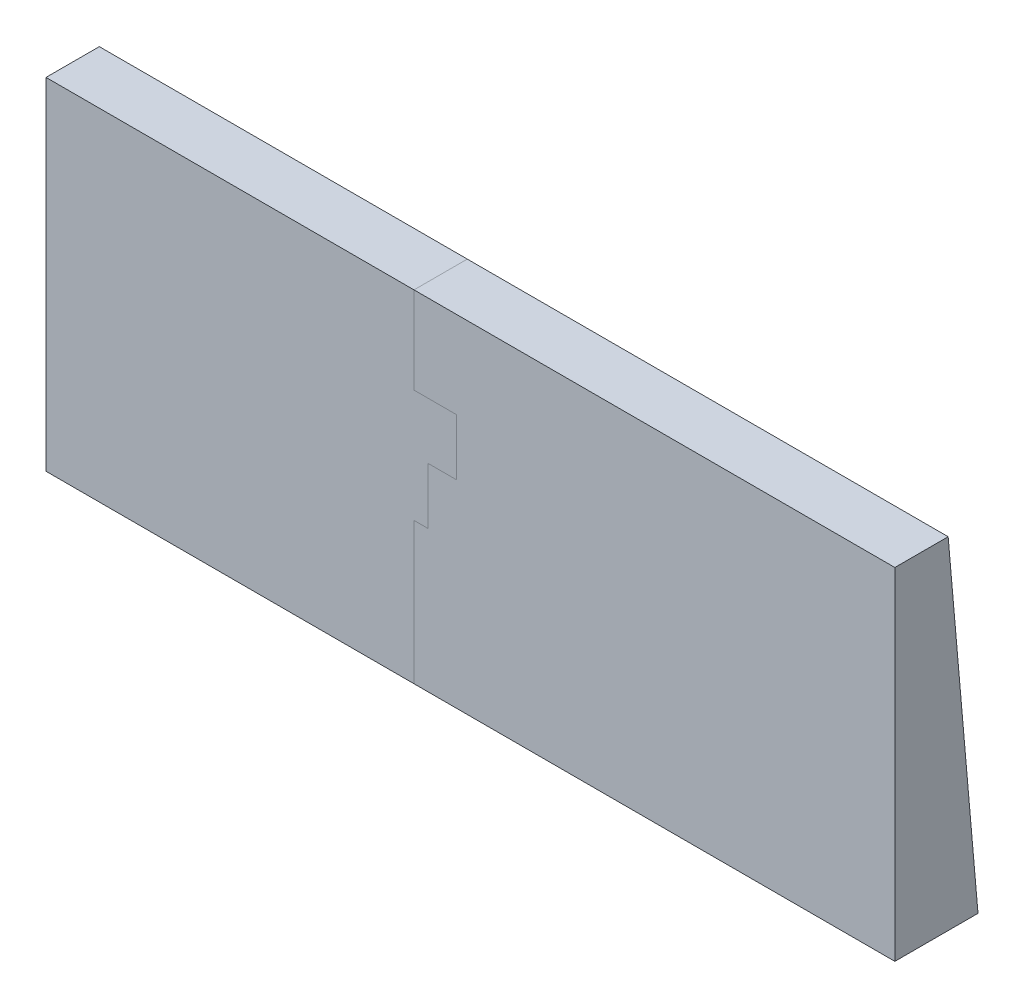
ISO-10303-21;
HEADER;
FILE_DESCRIPTION(('STEP AP214'),'2;1');
FILE_NAME('part.step','',(''),(''),'','','');
FILE_SCHEMA(('AUTOMOTIVE_DESIGN { 1 0 10303 214 1 1 1 1 }'));
ENDSEC;
DATA;
#1=APPLICATION_CONTEXT('core data for automotive mechanical design processes');
#2=APPLICATION_PROTOCOL_DEFINITION('international standard','automotive_design',2000,#1);
#3=PRODUCT_CONTEXT('',#1,'mechanical');
#4=PRODUCT('Part','Part','',(#3));
#5=PRODUCT_RELATED_PRODUCT_CATEGORY('part','',(#4));
#6=PRODUCT_DEFINITION_FORMATION('','',#4);
#7=PRODUCT_DEFINITION_CONTEXT('part definition',#1,'design');
#8=PRODUCT_DEFINITION('design','',#6,#7);
#9=PRODUCT_DEFINITION_SHAPE('','',#8);
#10=(LENGTH_UNIT() NAMED_UNIT(*) SI_UNIT(.MILLI.,.METRE.));
#11=(NAMED_UNIT(*) PLANE_ANGLE_UNIT() SI_UNIT($,.RADIAN.));
#12=(NAMED_UNIT(*) SI_UNIT($,.STERADIAN.) SOLID_ANGLE_UNIT());
#13=UNCERTAINTY_MEASURE_WITH_UNIT(LENGTH_MEASURE(1.E-05),#10,'distance_accuracy_value','');
#14=(GEOMETRIC_REPRESENTATION_CONTEXT(3) GLOBAL_UNCERTAINTY_ASSIGNED_CONTEXT((#13)) GLOBAL_UNIT_ASSIGNED_CONTEXT((#10,
#11,#12)) REPRESENTATION_CONTEXT('',''));
#15=CARTESIAN_POINT('',(0.,0.,0.));
#16=DIRECTION('',(0.,0.,1.));
#17=DIRECTION('',(1.,0.,0.));
#18=AXIS2_PLACEMENT_3D('',#15,#16,#17);
#19=CARTESIAN_POINT('',(-152.504909845493,105.48227561378,-10.0882189509876));
#20=DIRECTION('',(1.,0.,0.));
#21=DIRECTION('',(0.,1.,0.));
#22=AXIS2_PLACEMENT_3D('',#19,#20,#21);
#23=PLANE('',#22);
#24=DIRECTION('',(0.,-0.996194698091747,-0.087155742747645));
#25=VECTOR('',#24,1.);
#26=CARTESIAN_POINT('',(-152.504909845494,0.801256391980354,-9.15840246824548));
#27=LINE('',#26,#25);
#28=CARTESIAN_POINT('',(-152.504909845493,105.482275613781,0.));
#29=VERTEX_POINT('',#28);
#30=CARTESIAN_POINT('',(-152.504909845493,96.9822756137807,-0.743653639970255));
#31=VERTEX_POINT('',#30);
#32=EDGE_CURVE('E241',#29,#31,#27,.T.);
#33=ORIENTED_EDGE('',*,*,#32,.F.);
#34=DIRECTION('',(0.,0.,1.));
#35=VECTOR('',#34,1.);
#36=CARTESIAN_POINT('',(-152.504909845493,105.482275613781,15.));
#37=LINE('',#36,#35);
#38=CARTESIAN_POINT('',(-152.504909845493,105.482275613781,18.));
#39=VERTEX_POINT('',#38);
#40=EDGE_CURVE('E174',#29,#39,#37,.T.);
#41=ORIENTED_EDGE('',*,*,#40,.T.);
#42=DIRECTION('',(0.,1.,0.));
#43=VECTOR('',#42,1.);
#44=CARTESIAN_POINT('',(-152.504909845494,1.15496416266235E-12,18.));
#45=LINE('',#44,#43);
#46=CARTESIAN_POINT('',(-152.504909845493,76.1628442837967,18.));
#47=VERTEX_POINT('',#46);
#48=EDGE_CURVE('E246',#47,#39,#45,.T.);
#49=ORIENTED_EDGE('',*,*,#48,.F.);
#50=DIRECTION('',(0.,0.,1.));
#51=VECTOR('',#50,1.);
#52=CARTESIAN_POINT('',(-152.504909845493,76.1628442837967,-10.0882189509876));
#53=LINE('',#52,#51);
#54=CARTESIAN_POINT('',(-152.504909845493,76.1628442837967,15.));
#55=VERTEX_POINT('',#54);
#56=EDGE_CURVE('E12',#55,#47,#53,.T.);
#57=ORIENTED_EDGE('',*,*,#56,.F.);
#58=DIRECTION('',(0.,1.,0.));
#59=VECTOR('',#58,1.);
#60=CARTESIAN_POINT('',(-152.504909845494,1.15496416266235E-12,15.));
#61=LINE('',#60,#59);
#62=CARTESIAN_POINT('',(-152.504909845493,96.9822756137807,15.));
#63=VERTEX_POINT('',#62);
#64=EDGE_CURVE('E197',#55,#63,#61,.T.);
#65=ORIENTED_EDGE('',*,*,#64,.T.);
#66=DIRECTION('',(0.,0.,1.));
#67=VECTOR('',#66,1.);
#68=CARTESIAN_POINT('',(-152.504909845493,96.9822756137807,15.));
#69=LINE('',#68,#67);
#70=EDGE_CURVE('E236',#31,#63,#69,.T.);
#71=ORIENTED_EDGE('',*,*,#70,.F.);
#72=EDGE_LOOP('',(#33,#41,#49,#57,#65,#71));
#73=FACE_BOUND('',#72,.T.);
#74=ADVANCED_FACE('F51',(#73),#23,.T.);
#75=CARTESIAN_POINT('',(-152.504909845493,76.1628442837967,-10.0882189509876));
#76=DIRECTION('',(0.,1.,0.));
#77=DIRECTION('',(-1.,0.,0.));
#78=AXIS2_PLACEMENT_3D('',#75,#76,#77);
#79=PLANE('',#78);
#80=DIRECTION('',(0.,0.,1.));
#81=VECTOR('',#80,1.);
#82=CARTESIAN_POINT('',(-138.215345367269,76.1628442837966,-10.0882189509876));
#83=LINE('',#82,#81);
#84=CARTESIAN_POINT('',(-138.215345367269,76.1628442837966,15.));
#85=VERTEX_POINT('',#84);
#86=CARTESIAN_POINT('',(-138.215345367269,76.1628442837966,18.));
#87=VERTEX_POINT('',#86);
#88=EDGE_CURVE('E61',#85,#87,#83,.T.);
#89=ORIENTED_EDGE('',*,*,#88,.F.);
#90=DIRECTION('',(-1.,0.,0.));
#91=VECTOR('',#90,1.);
#92=CARTESIAN_POINT('',(5.91744720237408E-13,76.1628442837956,15.));
#93=LINE('',#92,#91);
#94=EDGE_CURVE('E194',#85,#55,#93,.T.);
#95=ORIENTED_EDGE('',*,*,#94,.T.);
#96=ORIENTED_EDGE('',*,*,#56,.T.);
#97=DIRECTION('',(-1.,0.,0.));
#98=VECTOR('',#97,1.);
#99=CARTESIAN_POINT('',(5.91744720237408E-13,76.1628442837956,18.));
#100=LINE('',#99,#98);
#101=EDGE_CURVE('E248',#87,#47,#100,.T.);
#102=ORIENTED_EDGE('',*,*,#101,.F.);
#103=EDGE_LOOP('',(#89,#95,#96,#102));
#104=FACE_BOUND('',#103,.T.);
#105=ADVANCED_FACE('F270',(#104),#79,.T.);
#106=CARTESIAN_POINT('',(-138.215345367269,57.1118917361692,-10.0882189509876));
#107=DIRECTION('',(1.,0.,0.));
#108=DIRECTION('',(0.,1.,0.));
#109=AXIS2_PLACEMENT_3D('',#106,#107,#108);
#110=PLANE('',#109);
#111=DIRECTION('',(0.,0.,1.));
#112=VECTOR('',#111,1.);
#113=CARTESIAN_POINT('',(-138.215345367269,57.1118917361692,-10.0882189509876));
#114=LINE('',#113,#112);
#115=CARTESIAN_POINT('',(-138.215345367269,57.1118917361692,15.));
#116=VERTEX_POINT('',#115);
#117=CARTESIAN_POINT('',(-138.215345367269,57.1118917361692,18.));
#118=VERTEX_POINT('',#117);
#119=EDGE_CURVE('E231',#116,#118,#114,.T.);
#120=ORIENTED_EDGE('',*,*,#119,.F.);
#121=DIRECTION('',(0.,1.,0.));
#122=VECTOR('',#121,1.);
#123=CARTESIAN_POINT('',(-138.21534536727,8.05470794174915E-13,15.));
#124=LINE('',#123,#122);
#125=EDGE_CURVE('E191',#116,#85,#124,.T.);
#126=ORIENTED_EDGE('',*,*,#125,.T.);
#127=ORIENTED_EDGE('',*,*,#88,.T.);
#128=DIRECTION('',(0.,1.,0.));
#129=VECTOR('',#128,1.);
#130=CARTESIAN_POINT('',(-138.21534536727,8.05470794174915E-13,18.));
#131=LINE('',#130,#129);
#132=EDGE_CURVE('E251',#118,#87,#131,.T.);
#133=ORIENTED_EDGE('',*,*,#132,.F.);
#134=EDGE_LOOP('',(#120,#126,#127,#133));
#135=FACE_BOUND('',#134,.T.);
#136=ADVANCED_FACE('F266',(#135),#110,.T.);
#137=CARTESIAN_POINT('',(-147.740821641083,57.1118917361693,-10.0882189509876));
#138=DIRECTION('',(0.,-1.,0.));
#139=DIRECTION('',(1.,0.,0.));
#140=AXIS2_PLACEMENT_3D('',#137,#138,#139);
#141=PLANE('',#140);
#142=DIRECTION('',(0.,0.,1.));
#143=VECTOR('',#142,1.);
#144=CARTESIAN_POINT('',(-147.740821641083,57.1118917361693,-10.0882189509876));
#145=LINE('',#144,#143);
#146=CARTESIAN_POINT('',(-147.740821641083,57.1118917361693,15.));
#147=VERTEX_POINT('',#146);
#148=CARTESIAN_POINT('',(-147.740821641083,57.1118917361693,18.));
#149=VERTEX_POINT('',#148);
#150=EDGE_CURVE('E233',#147,#149,#145,.T.);
#151=ORIENTED_EDGE('',*,*,#150,.F.);
#152=DIRECTION('',(1.,0.,0.));
#153=VECTOR('',#152,1.);
#154=CARTESIAN_POINT('',(3.32828172380763E-13,57.1118917361684,15.));
#155=LINE('',#154,#153);
#156=EDGE_CURVE('E188',#147,#116,#155,.T.);
#157=ORIENTED_EDGE('',*,*,#156,.T.);
#158=ORIENTED_EDGE('',*,*,#119,.T.);
#159=DIRECTION('',(1.,0.,0.));
#160=VECTOR('',#159,1.);
#161=CARTESIAN_POINT('',(3.32828172380763E-13,57.1118917361684,18.));
#162=LINE('',#161,#160);
#163=EDGE_CURVE('E254',#149,#118,#162,.T.);
#164=ORIENTED_EDGE('',*,*,#163,.F.);
#165=EDGE_LOOP('',(#151,#157,#158,#164));
#166=FACE_BOUND('',#165,.T.);
#167=ADVANCED_FACE('F262',(#166),#141,.T.);
#168=CARTESIAN_POINT('',(-147.740821641083,38.0608391835417,-10.0882189509876));
#169=DIRECTION('',(1.,0.,0.));
#170=DIRECTION('',(0.,1.,0.));
#171=AXIS2_PLACEMENT_3D('',#168,#169,#170);
#172=PLANE('',#171);
#173=DIRECTION('',(0.,0.,1.));
#174=VECTOR('',#173,1.);
#175=CARTESIAN_POINT('',(-147.740821641083,38.0608391835417,-10.0882189509876));
#176=LINE('',#175,#174);
#177=CARTESIAN_POINT('',(-147.740821641083,38.0608391835417,15.));
#178=VERTEX_POINT('',#177);
#179=CARTESIAN_POINT('',(-147.740821641083,38.0608391835417,18.));
#180=VERTEX_POINT('',#179);
#181=EDGE_CURVE('E160',#178,#180,#176,.T.);
#182=ORIENTED_EDGE('',*,*,#181,.F.);
#183=DIRECTION('',(0.,1.,0.));
#184=VECTOR('',#183,1.);
#185=CARTESIAN_POINT('',(-147.740821641083,8.60977425839633E-13,15.));
#186=LINE('',#185,#184);
#187=EDGE_CURVE('E185',#178,#147,#186,.T.);
#188=ORIENTED_EDGE('',*,*,#187,.T.);
#189=ORIENTED_EDGE('',*,*,#150,.T.);
#190=DIRECTION('',(0.,1.,0.));
#191=VECTOR('',#190,1.);
#192=CARTESIAN_POINT('',(-147.740821641083,8.60977425839633E-13,18.));
#193=LINE('',#192,#191);
#194=EDGE_CURVE('E168',#180,#149,#193,.T.);
#195=ORIENTED_EDGE('',*,*,#194,.F.);
#196=EDGE_LOOP('',(#182,#188,#189,#195));
#197=FACE_BOUND('',#196,.T.);
#198=ADVANCED_FACE('F258',(#197),#172,.T.);
#199=CARTESIAN_POINT('',(-152.504909845494,-9.71229411470659,-10.0882189509876));
#200=DIRECTION('',(1.,0.,0.));
#201=DIRECTION('',(0.,1.,0.));
#202=AXIS2_PLACEMENT_3D('',#199,#200,#201);
#203=PLANE('',#202);
#204=DIRECTION('',(0.,-0.996194698091747,-0.087155742747645));
#205=VECTOR('',#204,1.);
#206=CARTESIAN_POINT('',(-152.504909845494,0.801256391980263,-9.15840246824549));
#207=LINE('',#206,#205);
#208=CARTESIAN_POINT('',(-152.504909845494,-1.21229411470574,-9.33456531101734));
#209=VERTEX_POINT('',#208);
#210=CARTESIAN_POINT('',(-152.504909845493,-9.71229411470574,-10.0782189509876));
#211=VERTEX_POINT('',#210);
#212=EDGE_CURVE('E244',#209,#211,#207,.T.);
#213=ORIENTED_EDGE('',*,*,#212,.F.);
#214=DIRECTION('',(0.,0.,-1.));
#215=VECTOR('',#214,1.);
#216=CARTESIAN_POINT('',(-152.504909845494,-1.21229411470574,15.));
#217=LINE('',#216,#215);
#218=CARTESIAN_POINT('',(-152.504909845494,-1.21229411470574,15.));
#219=VERTEX_POINT('',#218);
#220=EDGE_CURVE('E239',#219,#209,#217,.T.);
#221=ORIENTED_EDGE('',*,*,#220,.F.);
#222=DIRECTION('',(0.,1.,0.));
#223=VECTOR('',#222,1.);
#224=CARTESIAN_POINT('',(-152.504909845494,1.06324067895119E-12,15.));
#225=LINE('',#224,#223);
#226=CARTESIAN_POINT('',(-152.504909845493,38.0608391835417,15.));
#227=VERTEX_POINT('',#226);
#228=EDGE_CURVE('E156',#219,#227,#225,.T.);
#229=ORIENTED_EDGE('',*,*,#228,.T.);
#230=DIRECTION('',(0.,0.,1.));
#231=VECTOR('',#230,1.);
#232=CARTESIAN_POINT('',(-152.504909845493,38.0608391835417,-10.0882189509876));
#233=LINE('',#232,#231);
#234=CARTESIAN_POINT('',(-152.504909845493,38.0608391835417,18.));
#235=VERTEX_POINT('',#234);
#236=EDGE_CURVE('E147',#227,#235,#233,.T.);
#237=ORIENTED_EDGE('',*,*,#236,.T.);
#238=DIRECTION('',(0.,1.,0.));
#239=VECTOR('',#238,1.);
#240=CARTESIAN_POINT('',(-152.504909845494,1.06324067895119E-12,18.));
#241=LINE('',#240,#239);
#242=CARTESIAN_POINT('',(-152.504909845493,-9.71229411470574,18.));
#243=VERTEX_POINT('',#242);
#244=EDGE_CURVE('E153',#243,#235,#241,.T.);
#245=ORIENTED_EDGE('',*,*,#244,.F.);
#246=DIRECTION('',(0.,0.,-1.));
#247=VECTOR('',#246,1.);
#248=CARTESIAN_POINT('',(-152.504909845494,-9.71229411470574,15.));
#249=LINE('',#248,#247);
#250=EDGE_CURVE('E177',#243,#211,#249,.T.);
#251=ORIENTED_EDGE('',*,*,#250,.T.);
#252=EDGE_LOOP('',(#213,#221,#229,#237,#245,#251));
#253=FACE_BOUND('',#252,.T.);
#254=ADVANCED_FACE('F150',(#253),#203,.T.);
#255=CARTESIAN_POINT('',(-152.504909845493,38.0608391835417,-10.0882189509876));
#256=DIRECTION('',(0.,-1.,0.));
#257=DIRECTION('',(1.,0.,0.));
#258=AXIS2_PLACEMENT_3D('',#255,#256,#257);
#259=PLANE('',#258);
#260=ORIENTED_EDGE('',*,*,#236,.F.);
#261=DIRECTION('',(1.,0.,0.));
#262=VECTOR('',#261,1.);
#263=CARTESIAN_POINT('',(4.43484862003633E-13,38.0608391835399,15.));
#264=LINE('',#263,#262);
#265=EDGE_CURVE('E183',#227,#178,#264,.T.);
#266=ORIENTED_EDGE('',*,*,#265,.T.);
#267=ORIENTED_EDGE('',*,*,#181,.T.);
#268=DIRECTION('',(1.,0.,0.));
#269=VECTOR('',#268,1.);
#270=CARTESIAN_POINT('',(4.43484862003633E-13,38.0608391835399,18.));
#271=LINE('',#270,#269);
#272=EDGE_CURVE('E163',#235,#180,#271,.T.);
#273=ORIENTED_EDGE('',*,*,#272,.F.);
#274=EDGE_LOOP('',(#260,#266,#267,#273));
#275=FACE_BOUND('',#274,.T.);
#276=ADVANCED_FACE('F164',(#275),#259,.T.);
#277=CARTESIAN_POINT('',(-268.278340417021,96.9822756137807,15.));
#278=DIRECTION('',(1.,0.,0.));
#279=DIRECTION('',(0.,0.,-1.));
#280=AXIS2_PLACEMENT_3D('',#277,#278,#279);
#281=PLANE('',#280);
#282=DIRECTION('',(0.,0.,-1.));
#283=VECTOR('',#282,1.);
#284=CARTESIAN_POINT('',(-268.278340417021,-1.21229411470574,15.));
#285=LINE('',#284,#283);
#286=CARTESIAN_POINT('',(-268.278340417021,-1.21229411470574,15.));
#287=VERTEX_POINT('',#286);
#288=CARTESIAN_POINT('',(-268.278340417021,-1.21229411470574,-9.33456531101734));
#289=VERTEX_POINT('',#288);
#290=EDGE_CURVE('E208',#287,#289,#285,.T.);
#291=ORIENTED_EDGE('',*,*,#290,.T.);
#292=DIRECTION('',(0.,-0.996194698091747,-0.087155742747645));
#293=VECTOR('',#292,1.);
#294=CARTESIAN_POINT('',(-268.278340417021,-26.5103543156332,-11.5478587877945));
#295=LINE('',#294,#293);
#296=CARTESIAN_POINT('',(-268.278340417021,96.9822756137807,-0.743653639970207));
#297=VERTEX_POINT('',#296);
#298=EDGE_CURVE('E215',#297,#289,#295,.T.);
#299=ORIENTED_EDGE('',*,*,#298,.F.);
#300=DIRECTION('',(0.,0.,-1.));
#301=VECTOR('',#300,1.);
#302=CARTESIAN_POINT('',(-268.278340417021,96.9822756137807,15.));
#303=LINE('',#302,#301);
#304=CARTESIAN_POINT('',(-268.278340417021,96.9822756137807,15.));
#305=VERTEX_POINT('',#304);
#306=EDGE_CURVE('E202',#305,#297,#303,.T.);
#307=ORIENTED_EDGE('',*,*,#306,.F.);
#308=DIRECTION('',(0.,-1.,0.));
#309=VECTOR('',#308,1.);
#310=CARTESIAN_POINT('',(-268.278340417021,96.9822756137807,15.));
#311=LINE('',#310,#309);
#312=EDGE_CURVE('E207',#305,#287,#311,.T.);
#313=ORIENTED_EDGE('',*,*,#312,.T.);
#314=EDGE_LOOP('',(#291,#299,#307,#313));
#315=FACE_BOUND('',#314,.T.);
#316=ADVANCED_FACE('F295',(#315),#281,.T.);
#317=CARTESIAN_POINT('',(0.,0.,15.));
#318=DIRECTION('',(0.,0.,1.));
#319=DIRECTION('',(1.,0.,0.));
#320=AXIS2_PLACEMENT_3D('',#317,#318,#319);
#321=PLANE('',#320);
#322=ORIENTED_EDGE('',*,*,#228,.F.);
#323=DIRECTION('',(1.,0.,0.));
#324=VECTOR('',#323,1.);
#325=CARTESIAN_POINT('',(-268.278340417021,-1.21229411470574,15.));
#326=LINE('',#325,#324);
#327=EDGE_CURVE('E204',#287,#219,#326,.T.);
#328=ORIENTED_EDGE('',*,*,#327,.F.);
#329=ORIENTED_EDGE('',*,*,#312,.F.);
#330=DIRECTION('',(-1.,0.,0.));
#331=VECTOR('',#330,1.);
#332=CARTESIAN_POINT('',(1.37491064553228,96.9822756137807,15.));
#333=LINE('',#332,#331);
#334=EDGE_CURVE('E209',#63,#305,#333,.T.);
#335=ORIENTED_EDGE('',*,*,#334,.F.);
#336=ORIENTED_EDGE('',*,*,#64,.F.);
#337=ORIENTED_EDGE('',*,*,#94,.F.);
#338=ORIENTED_EDGE('',*,*,#125,.F.);
#339=ORIENTED_EDGE('',*,*,#156,.F.);
#340=ORIENTED_EDGE('',*,*,#187,.F.);
#341=ORIENTED_EDGE('',*,*,#265,.F.);
#342=EDGE_LOOP('',(#322,#328,#329,#335,#336,#337,#338,#339,#340,#341));
#343=FACE_BOUND('',#342,.T.);
#344=ADVANCED_FACE('F286',(#343),#321,.F.);
#345=CARTESIAN_POINT('',(0.,0.801256391979208,-9.15840246824558));
#346=DIRECTION('',(0.,0.087155742747645,-0.996194698091747));
#347=DIRECTION('',(0.,0.996194698091747,0.087155742747645));
#348=AXIS2_PLACEMENT_3D('',#345,#346,#347);
#349=PLANE('',#348);
#350=DIRECTION('',(1.,0.,0.));
#351=VECTOR('',#350,1.);
#352=CARTESIAN_POINT('',(0.,-1.21229411470574,-9.33456531101734));
#353=LINE('',#352,#351);
#354=EDGE_CURVE('E217',#289,#209,#353,.T.);
#355=ORIENTED_EDGE('',*,*,#354,.T.);
#356=ORIENTED_EDGE('',*,*,#212,.T.);
#357=DIRECTION('',(-1.,0.,0.));
#358=VECTOR('',#357,1.);
#359=CARTESIAN_POINT('',(0.,-9.71229411470574,-10.0782189509876));
#360=LINE('',#359,#358);
#361=CARTESIAN_POINT('',(-276.778340417021,-9.71229411470574,-10.0782189509876));
#362=VERTEX_POINT('',#361);
#363=EDGE_CURVE('E55',#211,#362,#360,.T.);
#364=ORIENTED_EDGE('',*,*,#363,.T.);
#365=DIRECTION('',(0.,0.996194698091747,0.087155742747645));
#366=VECTOR('',#365,1.);
#367=CARTESIAN_POINT('',(-276.778340417021,-26.5103543156332,-11.5478587877945));
#368=LINE('',#367,#366);
#369=CARTESIAN_POINT('',(-276.778340417021,105.482275613781,0.));
#370=VERTEX_POINT('',#369);
#371=EDGE_CURVE('E219',#362,#370,#368,.T.);
#372=ORIENTED_EDGE('',*,*,#371,.T.);
#373=DIRECTION('',(-1.,0.,0.));
#374=VECTOR('',#373,1.);
#375=CARTESIAN_POINT('',(9.87491064553228,105.482275613781,0.));
#376=LINE('',#375,#374);
#377=EDGE_CURVE('E200',#29,#370,#376,.T.);
#378=ORIENTED_EDGE('',*,*,#377,.F.);
#379=ORIENTED_EDGE('',*,*,#32,.T.);
#380=DIRECTION('',(-1.,0.,0.));
#381=VECTOR('',#380,1.);
#382=CARTESIAN_POINT('',(0.,96.9822756137807,-0.743653639970254));
#383=LINE('',#382,#381);
#384=EDGE_CURVE('E216',#31,#297,#383,.T.);
#385=ORIENTED_EDGE('',*,*,#384,.T.);
#386=ORIENTED_EDGE('',*,*,#298,.T.);
#387=EDGE_LOOP('',(#355,#356,#364,#372,#378,#379,#385,#386));
#388=FACE_BOUND('',#387,.T.);
#389=ADVANCED_FACE('F283',(#388),#349,.T.);
#390=CARTESIAN_POINT('',(1.37491064553228,96.9822756137807,15.));
#391=DIRECTION('',(0.,-1.,0.));
#392=DIRECTION('',(1.,0.,0.));
#393=AXIS2_PLACEMENT_3D('',#390,#391,#392);
#394=PLANE('',#393);
#395=ORIENTED_EDGE('',*,*,#384,.F.);
#396=ORIENTED_EDGE('',*,*,#70,.T.);
#397=ORIENTED_EDGE('',*,*,#334,.T.);
#398=ORIENTED_EDGE('',*,*,#306,.T.);
#399=EDGE_LOOP('',(#395,#396,#397,#398));
#400=FACE_BOUND('',#399,.T.);
#401=ADVANCED_FACE('F285',(#400),#394,.T.);
#402=CARTESIAN_POINT('',(-268.278340417021,-1.21229411470574,15.));
#403=DIRECTION('',(0.,1.,0.));
#404=DIRECTION('',(0.,0.,1.));
#405=AXIS2_PLACEMENT_3D('',#402,#403,#404);
#406=PLANE('',#405);
#407=ORIENTED_EDGE('',*,*,#327,.T.);
#408=ORIENTED_EDGE('',*,*,#220,.T.);
#409=ORIENTED_EDGE('',*,*,#354,.F.);
#410=ORIENTED_EDGE('',*,*,#290,.F.);
#411=EDGE_LOOP('',(#407,#408,#409,#410));
#412=FACE_BOUND('',#411,.T.);
#413=ADVANCED_FACE('F292',(#412),#406,.T.);
#414=CARTESIAN_POINT('',(-276.778340417021,-9.71229411470574,15.));
#415=DIRECTION('',(0.,1.,0.));
#416=DIRECTION('',(0.,0.,1.));
#417=AXIS2_PLACEMENT_3D('',#414,#415,#416);
#418=PLANE('',#417);
#419=ORIENTED_EDGE('',*,*,#250,.F.);
#420=DIRECTION('',(1.,0.,0.));
#421=VECTOR('',#420,1.);
#422=CARTESIAN_POINT('',(-276.778340417021,-9.71229411470574,18.));
#423=LINE('',#422,#421);
#424=CARTESIAN_POINT('',(-276.778340417021,-9.71229411470574,18.));
#425=VERTEX_POINT('',#424);
#426=EDGE_CURVE('E173',#425,#243,#423,.T.);
#427=ORIENTED_EDGE('',*,*,#426,.F.);
#428=DIRECTION('',(0.,0.,-1.));
#429=VECTOR('',#428,1.);
#430=CARTESIAN_POINT('',(-276.778340417021,-9.71229411470574,15.));
#431=LINE('',#430,#429);
#432=EDGE_CURVE('E203',#425,#362,#431,.T.);
#433=ORIENTED_EDGE('',*,*,#432,.T.);
#434=ORIENTED_EDGE('',*,*,#363,.F.);
#435=EDGE_LOOP('',(#419,#427,#433,#434));
#436=FACE_BOUND('',#435,.T.);
#437=ADVANCED_FACE('F282',(#436),#418,.F.);
#438=CARTESIAN_POINT('',(-276.778340417021,105.482275613781,15.));
#439=DIRECTION('',(1.,0.,0.));
#440=DIRECTION('',(0.,0.,-1.));
#441=AXIS2_PLACEMENT_3D('',#438,#439,#440);
#442=PLANE('',#441);
#443=DIRECTION('',(0.,0.,-1.));
#444=VECTOR('',#443,1.);
#445=CARTESIAN_POINT('',(-276.778340417021,105.482275613781,15.));
#446=LINE('',#445,#444);
#447=CARTESIAN_POINT('',(-276.778340417021,105.482275613781,18.));
#448=VERTEX_POINT('',#447);
#449=EDGE_CURVE('E238',#448,#370,#446,.T.);
#450=ORIENTED_EDGE('',*,*,#449,.T.);
#451=ORIENTED_EDGE('',*,*,#371,.F.);
#452=ORIENTED_EDGE('',*,*,#432,.F.);
#453=DIRECTION('',(0.,-1.,0.));
#454=VECTOR('',#453,1.);
#455=CARTESIAN_POINT('',(-276.778340417021,105.482275613781,18.));
#456=LINE('',#455,#454);
#457=EDGE_CURVE('E212',#448,#425,#456,.T.);
#458=ORIENTED_EDGE('',*,*,#457,.F.);
#459=EDGE_LOOP('',(#450,#451,#452,#458));
#460=FACE_BOUND('',#459,.T.);
#461=ADVANCED_FACE('F308',(#460),#442,.F.);
#462=CARTESIAN_POINT('',(9.87491064553228,105.482275613781,15.));
#463=DIRECTION('',(0.,-1.,0.));
#464=DIRECTION('',(0.,0.,-1.));
#465=AXIS2_PLACEMENT_3D('',#462,#463,#464);
#466=PLANE('',#465);
#467=ORIENTED_EDGE('',*,*,#40,.F.);
#468=ORIENTED_EDGE('',*,*,#377,.T.);
#469=ORIENTED_EDGE('',*,*,#449,.F.);
#470=DIRECTION('',(-1.,0.,0.));
#471=VECTOR('',#470,1.);
#472=CARTESIAN_POINT('',(9.87491064553228,105.482275613781,18.));
#473=LINE('',#472,#471);
#474=EDGE_CURVE('E213',#39,#448,#473,.T.);
#475=ORIENTED_EDGE('',*,*,#474,.F.);
#476=EDGE_LOOP('',(#467,#468,#469,#475));
#477=FACE_BOUND('',#476,.T.);
#478=ADVANCED_FACE('F278',(#477),#466,.F.);
#479=CARTESIAN_POINT('',(0.,0.,18.));
#480=DIRECTION('',(0.,0.,1.));
#481=DIRECTION('',(1.,0.,0.));
#482=AXIS2_PLACEMENT_3D('',#479,#480,#481);
#483=PLANE('',#482);
#484=ORIENTED_EDGE('',*,*,#426,.T.);
#485=ORIENTED_EDGE('',*,*,#244,.T.);
#486=ORIENTED_EDGE('',*,*,#272,.T.);
#487=ORIENTED_EDGE('',*,*,#194,.T.);
#488=ORIENTED_EDGE('',*,*,#163,.T.);
#489=ORIENTED_EDGE('',*,*,#132,.T.);
#490=ORIENTED_EDGE('',*,*,#101,.T.);
#491=ORIENTED_EDGE('',*,*,#48,.T.);
#492=ORIENTED_EDGE('',*,*,#474,.T.);
#493=ORIENTED_EDGE('',*,*,#457,.T.);
#494=EDGE_LOOP('',(#484,#485,#486,#487,#488,#489,#490,#491,#492,#493));
#495=FACE_BOUND('',#494,.T.);
#496=ADVANCED_FACE('F53',(#495),#483,.T.);
#497=CLOSED_SHELL('',(#74,#105,#136,#167,#198,#254,#276,#316,#344,#389,#401,#413,#437,#461,#478,#496));
#498=MANIFOLD_SOLID_BREP('B2',#497);
#499=CARTESIAN_POINT('',(-152.504909845493,105.48227561378,-10.0882189509876));
#500=DIRECTION('',(1.,0.,0.));
#501=DIRECTION('',(0.,1.,0.));
#502=AXIS2_PLACEMENT_3D('',#499,#500,#501);
#503=PLANE('',#502);
#504=DIRECTION('',(0.,-0.996194698091747,-0.087155742747645));
#505=VECTOR('',#504,1.);
#506=CARTESIAN_POINT('',(-152.504909845494,0.801256391980354,-9.15840246824548));
#507=LINE('',#506,#505);
#508=CARTESIAN_POINT('',(-152.504909845493,105.482275613781,0.));
#509=VERTEX_POINT('',#508);
#510=CARTESIAN_POINT('',(-152.504909845493,96.9822756137807,-0.743653639970255));
#511=VERTEX_POINT('',#510);
#512=EDGE_CURVE('E621',#509,#511,#507,.T.);
#513=ORIENTED_EDGE('',*,*,#512,.T.);
#514=DIRECTION('',(0.,0.,1.));
#515=VECTOR('',#514,1.);
#516=CARTESIAN_POINT('',(-152.504909845493,96.9822756137807,15.));
#517=LINE('',#516,#515);
#518=CARTESIAN_POINT('',(-152.504909845493,96.9822756137807,15.));
#519=VERTEX_POINT('',#518);
#520=EDGE_CURVE('E477',#511,#519,#517,.T.);
#521=ORIENTED_EDGE('',*,*,#520,.T.);
#522=DIRECTION('',(0.,1.,0.));
#523=VECTOR('',#522,1.);
#524=CARTESIAN_POINT('',(-152.504909845494,1.15496416266235E-12,15.));
#525=LINE('',#524,#523);
#526=CARTESIAN_POINT('',(-152.504909845493,76.1628442837967,15.));
#527=VERTEX_POINT('',#526);
#528=EDGE_CURVE('E485',#527,#519,#525,.T.);
#529=ORIENTED_EDGE('',*,*,#528,.F.);
#530=DIRECTION('',(0.,0.,1.));
#531=VECTOR('',#530,1.);
#532=CARTESIAN_POINT('',(-152.504909845493,76.1628442837967,-10.0882189509876));
#533=LINE('',#532,#531);
#534=CARTESIAN_POINT('',(-152.504909845493,76.1628442837967,18.));
#535=VERTEX_POINT('',#534);
#536=EDGE_CURVE('E49',#527,#535,#533,.T.);
#537=ORIENTED_EDGE('',*,*,#536,.T.);
#538=DIRECTION('',(0.,1.,0.));
#539=VECTOR('',#538,1.);
#540=CARTESIAN_POINT('',(-152.504909845494,1.15496416266235E-12,18.));
#541=LINE('',#540,#539);
#542=CARTESIAN_POINT('',(-152.504909845493,105.482275613781,18.));
#543=VERTEX_POINT('',#542);
#544=EDGE_CURVE('E637',#535,#543,#541,.T.);
#545=ORIENTED_EDGE('',*,*,#544,.T.);
#546=DIRECTION('',(0.,0.,1.));
#547=VECTOR('',#546,1.);
#548=CARTESIAN_POINT('',(-152.504909845493,105.482275613781,15.));
#549=LINE('',#548,#547);
#550=EDGE_CURVE('E657',#509,#543,#549,.T.);
#551=ORIENTED_EDGE('',*,*,#550,.F.);
#552=EDGE_LOOP('',(#513,#521,#529,#537,#545,#551));
#553=FACE_BOUND('',#552,.T.);
#554=ADVANCED_FACE('F460',(#553),#503,.F.);
#555=CARTESIAN_POINT('',(-152.504909845493,76.1628442837967,-10.0882189509876));
#556=DIRECTION('',(0.,1.,0.));
#557=DIRECTION('',(-1.,0.,0.));
#558=AXIS2_PLACEMENT_3D('',#555,#556,#557);
#559=PLANE('',#558);
#560=DIRECTION('',(0.,0.,1.));
#561=VECTOR('',#560,1.);
#562=CARTESIAN_POINT('',(-138.215345367269,76.1628442837966,-10.0882189509876));
#563=LINE('',#562,#561);
#564=CARTESIAN_POINT('',(-138.215345367269,76.1628442837966,15.));
#565=VERTEX_POINT('',#564);
#566=CARTESIAN_POINT('',(-138.215345367269,76.1628442837966,18.));
#567=VERTEX_POINT('',#566);
#568=EDGE_CURVE('E469',#565,#567,#563,.T.);
#569=ORIENTED_EDGE('',*,*,#568,.T.);
#570=DIRECTION('',(-1.,0.,0.));
#571=VECTOR('',#570,1.);
#572=CARTESIAN_POINT('',(5.91744720237408E-13,76.1628442837956,18.));
#573=LINE('',#572,#571);
#574=EDGE_CURVE('E640',#567,#535,#573,.T.);
#575=ORIENTED_EDGE('',*,*,#574,.T.);
#576=ORIENTED_EDGE('',*,*,#536,.F.);
#577=DIRECTION('',(-1.,0.,0.));
#578=VECTOR('',#577,1.);
#579=CARTESIAN_POINT('',(5.91744720237408E-13,76.1628442837956,15.));
#580=LINE('',#579,#578);
#581=EDGE_CURVE('E622',#565,#527,#580,.T.);
#582=ORIENTED_EDGE('',*,*,#581,.F.);
#583=EDGE_LOOP('',(#569,#575,#576,#582));
#584=FACE_BOUND('',#583,.T.);
#585=ADVANCED_FACE('F697',(#584),#559,.F.);
#586=CARTESIAN_POINT('',(-138.215345367269,57.1118917361692,-10.0882189509876));
#587=DIRECTION('',(1.,0.,0.));
#588=DIRECTION('',(0.,1.,0.));
#589=AXIS2_PLACEMENT_3D('',#586,#587,#588);
#590=PLANE('',#589);
#591=DIRECTION('',(0.,0.,1.));
#592=VECTOR('',#591,1.);
#593=CARTESIAN_POINT('',(-138.215345367269,57.1118917361692,-10.0882189509876));
#594=LINE('',#593,#592);
#595=CARTESIAN_POINT('',(-138.215345367269,57.1118917361692,15.));
#596=VERTEX_POINT('',#595);
#597=CARTESIAN_POINT('',(-138.215345367269,57.1118917361692,18.));
#598=VERTEX_POINT('',#597);
#599=EDGE_CURVE('E668',#596,#598,#594,.T.);
#600=ORIENTED_EDGE('',*,*,#599,.T.);
#601=DIRECTION('',(0.,1.,0.));
#602=VECTOR('',#601,1.);
#603=CARTESIAN_POINT('',(-138.21534536727,8.05470794174915E-13,18.));
#604=LINE('',#603,#602);
#605=EDGE_CURVE('E643',#598,#567,#604,.T.);
#606=ORIENTED_EDGE('',*,*,#605,.T.);
#607=ORIENTED_EDGE('',*,*,#568,.F.);
#608=DIRECTION('',(0.,1.,0.));
#609=VECTOR('',#608,1.);
#610=CARTESIAN_POINT('',(-138.21534536727,8.05470794174915E-13,15.));
#611=LINE('',#610,#609);
#612=EDGE_CURVE('E624',#596,#565,#611,.T.);
#613=ORIENTED_EDGE('',*,*,#612,.F.);
#614=EDGE_LOOP('',(#600,#606,#607,#613));
#615=FACE_BOUND('',#614,.T.);
#616=ADVANCED_FACE('F695',(#615),#590,.F.);
#617=CARTESIAN_POINT('',(-147.740821641083,57.1118917361693,-10.0882189509876));
#618=DIRECTION('',(0.,-1.,0.));
#619=DIRECTION('',(1.,0.,0.));
#620=AXIS2_PLACEMENT_3D('',#617,#618,#619);
#621=PLANE('',#620);
#622=DIRECTION('',(0.,0.,1.));
#623=VECTOR('',#622,1.);
#624=CARTESIAN_POINT('',(-147.740821641083,57.1118917361693,-10.0882189509876));
#625=LINE('',#624,#623);
#626=CARTESIAN_POINT('',(-147.740821641083,57.1118917361693,15.));
#627=VERTEX_POINT('',#626);
#628=CARTESIAN_POINT('',(-147.740821641083,57.1118917361693,18.));
#629=VERTEX_POINT('',#628);
#630=EDGE_CURVE('E665',#627,#629,#625,.T.);
#631=ORIENTED_EDGE('',*,*,#630,.T.);
#632=DIRECTION('',(1.,0.,0.));
#633=VECTOR('',#632,1.);
#634=CARTESIAN_POINT('',(3.32828172380763E-13,57.1118917361684,18.));
#635=LINE('',#634,#633);
#636=EDGE_CURVE('E646',#629,#598,#635,.T.);
#637=ORIENTED_EDGE('',*,*,#636,.T.);
#638=ORIENTED_EDGE('',*,*,#599,.F.);
#639=DIRECTION('',(1.,0.,0.));
#640=VECTOR('',#639,1.);
#641=CARTESIAN_POINT('',(3.32828172380763E-13,57.1118917361684,15.));
#642=LINE('',#641,#640);
#643=EDGE_CURVE('E627',#627,#596,#642,.T.);
#644=ORIENTED_EDGE('',*,*,#643,.F.);
#645=EDGE_LOOP('',(#631,#637,#638,#644));
#646=FACE_BOUND('',#645,.T.);
#647=ADVANCED_FACE('F693',(#646),#621,.F.);
#648=CARTESIAN_POINT('',(-147.740821641083,38.0608391835417,-10.0882189509876));
#649=DIRECTION('',(1.,0.,0.));
#650=DIRECTION('',(0.,1.,0.));
#651=AXIS2_PLACEMENT_3D('',#648,#649,#650);
#652=PLANE('',#651);
#653=DIRECTION('',(0.,0.,1.));
#654=VECTOR('',#653,1.);
#655=CARTESIAN_POINT('',(-147.740821641083,38.0608391835417,-10.0882189509876));
#656=LINE('',#655,#654);
#657=CARTESIAN_POINT('',(-147.740821641083,38.0608391835417,15.));
#658=VERTEX_POINT('',#657);
#659=CARTESIAN_POINT('',(-147.740821641083,38.0608391835417,18.));
#660=VERTEX_POINT('',#659);
#661=EDGE_CURVE('E662',#658,#660,#656,.T.);
#662=ORIENTED_EDGE('',*,*,#661,.T.);
#663=DIRECTION('',(0.,1.,0.));
#664=VECTOR('',#663,1.);
#665=CARTESIAN_POINT('',(-147.740821641083,8.60977425839633E-13,18.));
#666=LINE('',#665,#664);
#667=EDGE_CURVE('E649',#660,#629,#666,.T.);
#668=ORIENTED_EDGE('',*,*,#667,.T.);
#669=ORIENTED_EDGE('',*,*,#630,.F.);
#670=DIRECTION('',(0.,1.,0.));
#671=VECTOR('',#670,1.);
#672=CARTESIAN_POINT('',(-147.740821641083,8.60977425839633E-13,15.));
#673=LINE('',#672,#671);
#674=EDGE_CURVE('E630',#658,#627,#673,.T.);
#675=ORIENTED_EDGE('',*,*,#674,.F.);
#676=EDGE_LOOP('',(#662,#668,#669,#675));
#677=FACE_BOUND('',#676,.T.);
#678=ADVANCED_FACE('F689',(#677),#652,.F.);
#679=CARTESIAN_POINT('',(-152.504909845494,-9.71229411470659,-10.0882189509876));
#680=DIRECTION('',(1.,0.,0.));
#681=DIRECTION('',(0.,1.,0.));
#682=AXIS2_PLACEMENT_3D('',#679,#680,#681);
#683=PLANE('',#682);
#684=DIRECTION('',(0.,-0.996194698091747,-0.087155742747645));
#685=VECTOR('',#684,1.);
#686=CARTESIAN_POINT('',(-152.504909845494,0.801256391980263,-9.15840246824549));
#687=LINE('',#686,#685);
#688=CARTESIAN_POINT('',(-152.504909845494,-1.21229411470574,-9.33456531101734));
#689=VERTEX_POINT('',#688);
#690=CARTESIAN_POINT('',(-152.504909845493,-9.71229411470574,-10.0782189509876));
#691=VERTEX_POINT('',#690);
#692=EDGE_CURVE('E464',#689,#691,#687,.T.);
#693=ORIENTED_EDGE('',*,*,#692,.T.);
#694=DIRECTION('',(0.,0.,-1.));
#695=VECTOR('',#694,1.);
#696=CARTESIAN_POINT('',(-152.504909845494,-9.71229411470574,15.));
#697=LINE('',#696,#695);
#698=CARTESIAN_POINT('',(-152.504909845493,-9.71229411470574,18.));
#699=VERTEX_POINT('',#698);
#700=EDGE_CURVE('E581',#699,#691,#697,.T.);
#701=ORIENTED_EDGE('',*,*,#700,.F.);
#702=DIRECTION('',(0.,1.,0.));
#703=VECTOR('',#702,1.);
#704=CARTESIAN_POINT('',(-152.504909845494,1.06324067895119E-12,18.));
#705=LINE('',#704,#703);
#706=CARTESIAN_POINT('',(-152.504909845493,38.0608391835417,18.));
#707=VERTEX_POINT('',#706);
#708=EDGE_CURVE('E655',#699,#707,#705,.T.);
#709=ORIENTED_EDGE('',*,*,#708,.T.);
#710=DIRECTION('',(0.,0.,1.));
#711=VECTOR('',#710,1.);
#712=CARTESIAN_POINT('',(-152.504909845493,38.0608391835417,-10.0882189509876));
#713=LINE('',#712,#711);
#714=CARTESIAN_POINT('',(-152.504909845493,38.0608391835417,15.));
#715=VERTEX_POINT('',#714);
#716=EDGE_CURVE('E618',#715,#707,#713,.T.);
#717=ORIENTED_EDGE('',*,*,#716,.F.);
#718=DIRECTION('',(0.,1.,0.));
#719=VECTOR('',#718,1.);
#720=CARTESIAN_POINT('',(-152.504909845494,1.06324067895119E-12,15.));
#721=LINE('',#720,#719);
#722=CARTESIAN_POINT('',(-152.504909845494,-1.21229411470574,15.));
#723=VERTEX_POINT('',#722);
#724=EDGE_CURVE('E636',#723,#715,#721,.T.);
#725=ORIENTED_EDGE('',*,*,#724,.F.);
#726=DIRECTION('',(0.,0.,-1.));
#727=VECTOR('',#726,1.);
#728=CARTESIAN_POINT('',(-152.504909845494,-1.21229411470574,15.));
#729=LINE('',#728,#727);
#730=EDGE_CURVE('E619',#723,#689,#729,.T.);
#731=ORIENTED_EDGE('',*,*,#730,.T.);
#732=EDGE_LOOP('',(#693,#701,#709,#717,#725,#731));
#733=FACE_BOUND('',#732,.T.);
#734=ADVANCED_FACE('F462',(#733),#683,.F.);
#735=CARTESIAN_POINT('',(-152.504909845493,38.0608391835417,-10.0882189509876));
#736=DIRECTION('',(0.,-1.,0.));
#737=DIRECTION('',(1.,0.,0.));
#738=AXIS2_PLACEMENT_3D('',#735,#736,#737);
#739=PLANE('',#738);
#740=ORIENTED_EDGE('',*,*,#716,.T.);
#741=DIRECTION('',(1.,0.,0.));
#742=VECTOR('',#741,1.);
#743=CARTESIAN_POINT('',(4.43484862003633E-13,38.0608391835399,18.));
#744=LINE('',#743,#742);
#745=EDGE_CURVE('E652',#707,#660,#744,.T.);
#746=ORIENTED_EDGE('',*,*,#745,.T.);
#747=ORIENTED_EDGE('',*,*,#661,.F.);
#748=DIRECTION('',(1.,0.,0.));
#749=VECTOR('',#748,1.);
#750=CARTESIAN_POINT('',(4.43484862003633E-13,38.0608391835399,15.));
#751=LINE('',#750,#749);
#752=EDGE_CURVE('E633',#715,#658,#751,.T.);
#753=ORIENTED_EDGE('',*,*,#752,.F.);
#754=EDGE_LOOP('',(#740,#746,#747,#753));
#755=FACE_BOUND('',#754,.T.);
#756=ADVANCED_FACE('F683',(#755),#739,.F.);
#757=CARTESIAN_POINT('',(-276.778340417021,-9.71229411470574,15.));
#758=DIRECTION('',(0.,1.,0.));
#759=DIRECTION('',(0.,0.,1.));
#760=AXIS2_PLACEMENT_3D('',#757,#758,#759);
#761=PLANE('',#760);
#762=DIRECTION('',(1.,0.,0.));
#763=VECTOR('',#762,1.);
#764=CARTESIAN_POINT('',(-276.778340417021,-9.71229411470574,18.));
#765=LINE('',#764,#763);
#766=CARTESIAN_POINT('',(9.87491064553228,-9.71229411470574,18.));
#767=VERTEX_POINT('',#766);
#768=EDGE_CURVE('E599',#699,#767,#765,.T.);
#769=ORIENTED_EDGE('',*,*,#768,.F.);
#770=ORIENTED_EDGE('',*,*,#700,.T.);
#771=DIRECTION('',(-1.,0.,0.));
#772=VECTOR('',#771,1.);
#773=CARTESIAN_POINT('',(0.,-9.71229411470574,-10.0782189509876));
#774=LINE('',#773,#772);
#775=CARTESIAN_POINT('',(9.87491064553225,-9.71229411470574,-10.0782189509876));
#776=VERTEX_POINT('',#775);
#777=EDGE_CURVE('E578',#776,#691,#774,.T.);
#778=ORIENTED_EDGE('',*,*,#777,.F.);
#779=DIRECTION('',(0.,0.,-1.));
#780=VECTOR('',#779,1.);
#781=CARTESIAN_POINT('',(9.87491064553228,-9.71229411470574,15.));
#782=LINE('',#781,#780);
#783=EDGE_CURVE('E564',#767,#776,#782,.T.);
#784=ORIENTED_EDGE('',*,*,#783,.F.);
#785=EDGE_LOOP('',(#769,#770,#778,#784));
#786=FACE_BOUND('',#785,.T.);
#787=ADVANCED_FACE('F579',(#786),#761,.F.);
#788=CARTESIAN_POINT('',(9.87491064553228,-9.71229411470574,15.));
#789=DIRECTION('',(-1.,0.,0.));
#790=DIRECTION('',(0.,0.,1.));
#791=AXIS2_PLACEMENT_3D('',#788,#789,#790);
#792=PLANE('',#791);
#793=ORIENTED_EDGE('',*,*,#783,.T.);
#794=DIRECTION('',(0.,-0.996194698091747,-0.087155742747645));
#795=VECTOR('',#794,1.);
#796=CARTESIAN_POINT('',(9.87491064553228,-26.5103543156332,-11.5478587877945));
#797=LINE('',#796,#795);
#798=CARTESIAN_POINT('',(9.87491064553228,105.482275613781,0.));
#799=VERTEX_POINT('',#798);
#800=EDGE_CURVE('E568',#799,#776,#797,.T.);
#801=ORIENTED_EDGE('',*,*,#800,.F.);
#802=DIRECTION('',(0.,0.,-1.));
#803=VECTOR('',#802,1.);
#804=CARTESIAN_POINT('',(9.87491064553228,105.482275613781,15.));
#805=LINE('',#804,#803);
#806=CARTESIAN_POINT('',(9.87491064553228,105.482275613781,18.));
#807=VERTEX_POINT('',#806);
#808=EDGE_CURVE('E574',#807,#799,#805,.T.);
#809=ORIENTED_EDGE('',*,*,#808,.F.);
#810=DIRECTION('',(0.,1.,0.));
#811=VECTOR('',#810,1.);
#812=CARTESIAN_POINT('',(9.87491064553228,-9.71229411470574,18.));
#813=LINE('',#812,#811);
#814=EDGE_CURVE('E571',#767,#807,#813,.T.);
#815=ORIENTED_EDGE('',*,*,#814,.F.);
#816=EDGE_LOOP('',(#793,#801,#809,#815));
#817=FACE_BOUND('',#816,.T.);
#818=ADVANCED_FACE('F566',(#817),#792,.F.);
#819=CARTESIAN_POINT('',(9.87491064553228,105.482275613781,15.));
#820=DIRECTION('',(0.,-1.,0.));
#821=DIRECTION('',(0.,0.,-1.));
#822=AXIS2_PLACEMENT_3D('',#819,#820,#821);
#823=PLANE('',#822);
#824=DIRECTION('',(-1.,0.,0.));
#825=VECTOR('',#824,1.);
#826=CARTESIAN_POINT('',(9.87491064553228,105.482275613781,0.));
#827=LINE('',#826,#825);
#828=EDGE_CURVE('E575',#799,#509,#827,.T.);
#829=ORIENTED_EDGE('',*,*,#828,.T.);
#830=ORIENTED_EDGE('',*,*,#550,.T.);
#831=DIRECTION('',(-1.,0.,0.));
#832=VECTOR('',#831,1.);
#833=CARTESIAN_POINT('',(9.87491064553228,105.482275613781,18.));
#834=LINE('',#833,#832);
#835=EDGE_CURVE('E596',#807,#543,#834,.T.);
#836=ORIENTED_EDGE('',*,*,#835,.F.);
#837=ORIENTED_EDGE('',*,*,#808,.T.);
#838=EDGE_LOOP('',(#829,#830,#836,#837));
#839=FACE_BOUND('',#838,.T.);
#840=ADVANCED_FACE('F713',(#839),#823,.F.);
#841=CARTESIAN_POINT('',(0.,0.,15.));
#842=DIRECTION('',(0.,0.,1.));
#843=DIRECTION('',(1.,0.,0.));
#844=AXIS2_PLACEMENT_3D('',#841,#842,#843);
#845=PLANE('',#844);
#846=DIRECTION('',(1.,0.,0.));
#847=VECTOR('',#846,1.);
#848=CARTESIAN_POINT('',(-268.278340417021,-1.21229411470574,15.));
#849=LINE('',#848,#847);
#850=CARTESIAN_POINT('',(1.37491064553228,-1.21229411470574,15.));
#851=VERTEX_POINT('',#850);
#852=EDGE_CURVE('E605',#723,#851,#849,.T.);
#853=ORIENTED_EDGE('',*,*,#852,.F.);
#854=ORIENTED_EDGE('',*,*,#724,.T.);
#855=ORIENTED_EDGE('',*,*,#752,.T.);
#856=ORIENTED_EDGE('',*,*,#674,.T.);
#857=ORIENTED_EDGE('',*,*,#643,.T.);
#858=ORIENTED_EDGE('',*,*,#612,.T.);
#859=ORIENTED_EDGE('',*,*,#581,.T.);
#860=ORIENTED_EDGE('',*,*,#528,.T.);
#861=DIRECTION('',(-1.,0.,0.));
#862=VECTOR('',#861,1.);
#863=CARTESIAN_POINT('',(1.37491064553228,96.9822756137807,15.));
#864=LINE('',#863,#862);
#865=CARTESIAN_POINT('',(1.37491064553228,96.9822756137807,15.));
#866=VERTEX_POINT('',#865);
#867=EDGE_CURVE('E603',#866,#519,#864,.T.);
#868=ORIENTED_EDGE('',*,*,#867,.F.);
#869=DIRECTION('',(0.,1.,0.));
#870=VECTOR('',#869,1.);
#871=CARTESIAN_POINT('',(1.37491064553228,-1.21229411470574,15.));
#872=LINE('',#871,#870);
#873=EDGE_CURVE('E607',#851,#866,#872,.T.);
#874=ORIENTED_EDGE('',*,*,#873,.F.);
#875=EDGE_LOOP('',(#853,#854,#855,#856,#857,#858,#859,#860,#868,#874));
#876=FACE_BOUND('',#875,.T.);
#877=ADVANCED_FACE('F677',(#876),#845,.F.);
#878=CARTESIAN_POINT('',(1.37491064553228,-1.21229411470574,15.));
#879=DIRECTION('',(-1.,0.,0.));
#880=DIRECTION('',(0.,0.,1.));
#881=AXIS2_PLACEMENT_3D('',#878,#879,#880);
#882=PLANE('',#881);
#883=DIRECTION('',(0.,0.,-1.));
#884=VECTOR('',#883,1.);
#885=CARTESIAN_POINT('',(1.37491064553228,96.9822756137807,15.));
#886=LINE('',#885,#884);
#887=CARTESIAN_POINT('',(1.37491064553228,96.9822756137807,-0.743653639970254));
#888=VERTEX_POINT('',#887);
#889=EDGE_CURVE('E610',#866,#888,#886,.T.);
#890=ORIENTED_EDGE('',*,*,#889,.T.);
#891=DIRECTION('',(0.,0.996194698091747,0.087155742747645));
#892=VECTOR('',#891,1.);
#893=CARTESIAN_POINT('',(1.37491064553228,-26.5103543156332,-11.5478587877945));
#894=LINE('',#893,#892);
#895=CARTESIAN_POINT('',(1.37491064553228,-1.21229411470574,-9.33456531101734));
#896=VERTEX_POINT('',#895);
#897=EDGE_CURVE('E595',#896,#888,#894,.T.);
#898=ORIENTED_EDGE('',*,*,#897,.F.);
#899=DIRECTION('',(0.,0.,-1.));
#900=VECTOR('',#899,1.);
#901=CARTESIAN_POINT('',(1.37491064553228,-1.21229411470574,15.));
#902=LINE('',#901,#900);
#903=EDGE_CURVE('E612',#851,#896,#902,.T.);
#904=ORIENTED_EDGE('',*,*,#903,.F.);
#905=ORIENTED_EDGE('',*,*,#873,.T.);
#906=EDGE_LOOP('',(#890,#898,#904,#905));
#907=FACE_BOUND('',#906,.T.);
#908=ADVANCED_FACE('F705',(#907),#882,.T.);
#909=CARTESIAN_POINT('',(0.,0.801256391979208,-9.15840246824558));
#910=DIRECTION('',(0.,0.087155742747645,-0.996194698091747));
#911=DIRECTION('',(0.,0.996194698091747,0.087155742747645));
#912=AXIS2_PLACEMENT_3D('',#909,#910,#911);
#913=PLANE('',#912);
#914=ORIENTED_EDGE('',*,*,#692,.F.);
#915=DIRECTION('',(1.,0.,0.));
#916=VECTOR('',#915,1.);
#917=CARTESIAN_POINT('',(0.,-1.21229411470574,-9.33456531101734));
#918=LINE('',#917,#916);
#919=EDGE_CURVE('E585',#689,#896,#918,.T.);
#920=ORIENTED_EDGE('',*,*,#919,.T.);
#921=ORIENTED_EDGE('',*,*,#897,.T.);
#922=DIRECTION('',(-1.,0.,0.));
#923=VECTOR('',#922,1.);
#924=CARTESIAN_POINT('',(0.,96.9822756137807,-0.743653639970254));
#925=LINE('',#924,#923);
#926=EDGE_CURVE('E600',#888,#511,#925,.T.);
#927=ORIENTED_EDGE('',*,*,#926,.T.);
#928=ORIENTED_EDGE('',*,*,#512,.F.);
#929=ORIENTED_EDGE('',*,*,#828,.F.);
#930=ORIENTED_EDGE('',*,*,#800,.T.);
#931=ORIENTED_EDGE('',*,*,#777,.T.);
#932=EDGE_LOOP('',(#914,#920,#921,#927,#928,#929,#930,#931));
#933=FACE_BOUND('',#932,.T.);
#934=ADVANCED_FACE('F587',(#933),#913,.T.);
#935=CARTESIAN_POINT('',(1.37491064553228,96.9822756137807,15.));
#936=DIRECTION('',(0.,-1.,0.));
#937=DIRECTION('',(1.,0.,0.));
#938=AXIS2_PLACEMENT_3D('',#935,#936,#937);
#939=PLANE('',#938);
#940=ORIENTED_EDGE('',*,*,#520,.F.);
#941=ORIENTED_EDGE('',*,*,#926,.F.);
#942=ORIENTED_EDGE('',*,*,#889,.F.);
#943=ORIENTED_EDGE('',*,*,#867,.T.);
#944=EDGE_LOOP('',(#940,#941,#942,#943));
#945=FACE_BOUND('',#944,.T.);
#946=ADVANCED_FACE('F702',(#945),#939,.T.);
#947=CARTESIAN_POINT('',(-268.278340417021,-1.21229411470574,15.));
#948=DIRECTION('',(0.,1.,0.));
#949=DIRECTION('',(0.,0.,1.));
#950=AXIS2_PLACEMENT_3D('',#947,#948,#949);
#951=PLANE('',#950);
#952=ORIENTED_EDGE('',*,*,#730,.F.);
#953=ORIENTED_EDGE('',*,*,#852,.T.);
#954=ORIENTED_EDGE('',*,*,#903,.T.);
#955=ORIENTED_EDGE('',*,*,#919,.F.);
#956=EDGE_LOOP('',(#952,#953,#954,#955));
#957=FACE_BOUND('',#956,.T.);
#958=ADVANCED_FACE('F710',(#957),#951,.T.);
#959=CARTESIAN_POINT('',(0.,0.,18.));
#960=DIRECTION('',(0.,0.,1.));
#961=DIRECTION('',(1.,0.,0.));
#962=AXIS2_PLACEMENT_3D('',#959,#960,#961);
#963=PLANE('',#962);
#964=ORIENTED_EDGE('',*,*,#708,.F.);
#965=ORIENTED_EDGE('',*,*,#768,.T.);
#966=ORIENTED_EDGE('',*,*,#814,.T.);
#967=ORIENTED_EDGE('',*,*,#835,.T.);
#968=ORIENTED_EDGE('',*,*,#544,.F.);
#969=ORIENTED_EDGE('',*,*,#574,.F.);
#970=ORIENTED_EDGE('',*,*,#605,.F.);
#971=ORIENTED_EDGE('',*,*,#636,.F.);
#972=ORIENTED_EDGE('',*,*,#667,.F.);
#973=ORIENTED_EDGE('',*,*,#745,.F.);
#974=EDGE_LOOP('',(#964,#965,#966,#967,#968,#969,#970,#971,#972,#973));
#975=FACE_BOUND('',#974,.T.);
#976=ADVANCED_FACE('F686',(#975),#963,.T.);
#977=CLOSED_SHELL('',(#554,#585,#616,#647,#678,#734,#756,#787,#818,#840,#877,#908,#934,#946,
#958,#976));
#978=MANIFOLD_SOLID_BREP('B6',#977);
#979=ADVANCED_BREP_SHAPE_REPRESENTATION('',(#18,#498,#978),#14);
#980=SHAPE_DEFINITION_REPRESENTATION(#9,#979);
ENDSEC;
END-ISO-10303-21;
